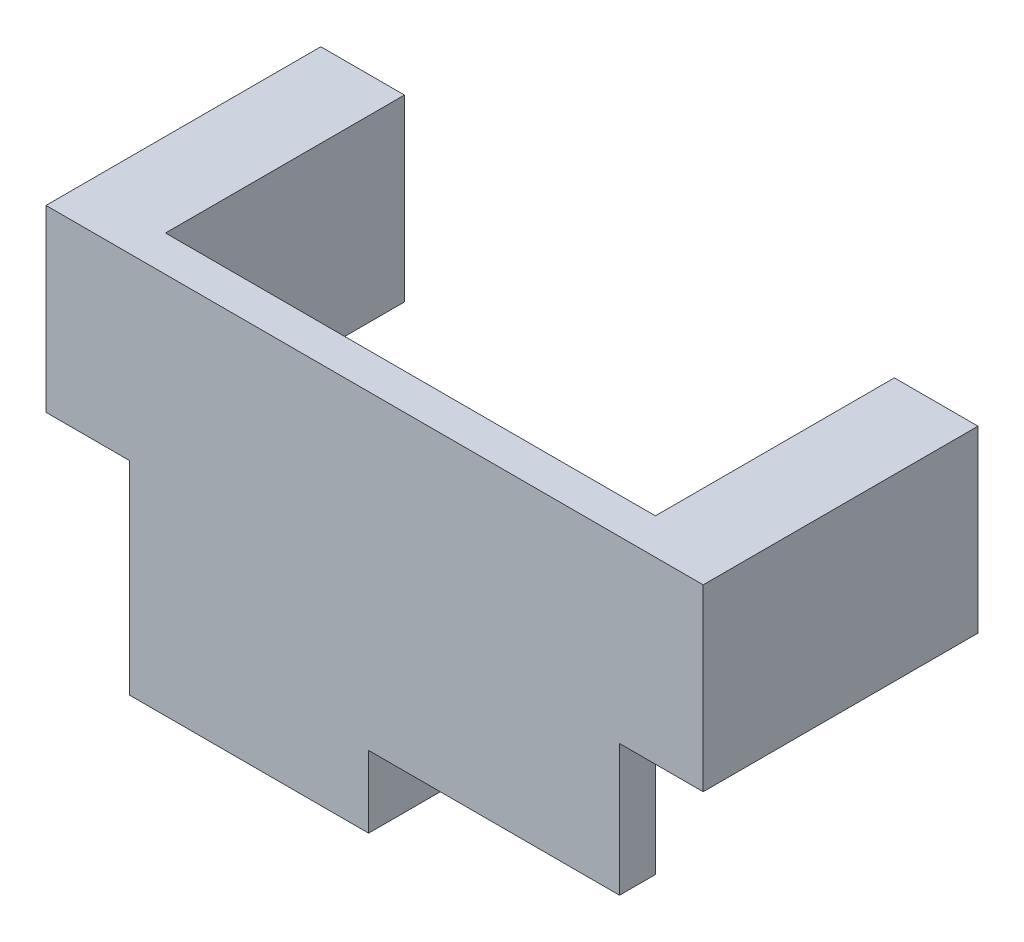
ISO-10303-21;
HEADER;
FILE_DESCRIPTION(('STEP AP214'),'2;1');
FILE_NAME('part.step','',(''),(''),'','','');
FILE_SCHEMA(('AUTOMOTIVE_DESIGN { 1 0 10303 214 1 1 1 1 }'));
ENDSEC;
DATA;
#1=APPLICATION_CONTEXT('core data for automotive mechanical design processes');
#2=APPLICATION_PROTOCOL_DEFINITION('international standard','automotive_design',2000,#1);
#3=PRODUCT_CONTEXT('',#1,'mechanical');
#4=PRODUCT('Part','Part','',(#3));
#5=PRODUCT_RELATED_PRODUCT_CATEGORY('part','',(#4));
#6=PRODUCT_DEFINITION_FORMATION('','',#4);
#7=PRODUCT_DEFINITION_CONTEXT('part definition',#1,'design');
#8=PRODUCT_DEFINITION('design','',#6,#7);
#9=PRODUCT_DEFINITION_SHAPE('','',#8);
#10=(LENGTH_UNIT() NAMED_UNIT(*) SI_UNIT(.MILLI.,.METRE.));
#11=(NAMED_UNIT(*) PLANE_ANGLE_UNIT() SI_UNIT($,.RADIAN.));
#12=(NAMED_UNIT(*) SI_UNIT($,.STERADIAN.) SOLID_ANGLE_UNIT());
#13=UNCERTAINTY_MEASURE_WITH_UNIT(LENGTH_MEASURE(1.E-05),#10,'distance_accuracy_value','');
#14=(GEOMETRIC_REPRESENTATION_CONTEXT(3) GLOBAL_UNCERTAINTY_ASSIGNED_CONTEXT((#13)) GLOBAL_UNIT_ASSIGNED_CONTEXT((#10,
#11,#12)) REPRESENTATION_CONTEXT('',''));
#15=CARTESIAN_POINT('',(0.,0.,0.));
#16=DIRECTION('',(0.,0.,1.));
#17=DIRECTION('',(1.,0.,0.));
#18=AXIS2_PLACEMENT_3D('',#15,#16,#17);
#19=CARTESIAN_POINT('',(-20.5,0.,-3.));
#20=DIRECTION('',(1.,0.,0.));
#21=DIRECTION('',(0.,0.,-1.));
#22=AXIS2_PLACEMENT_3D('',#19,#20,#21);
#23=PLANE('',#22);
#24=DIRECTION('',(0.,0.,1.));
#25=VECTOR('',#24,1.);
#26=CARTESIAN_POINT('',(-20.5,-2.,-63.8806130178211));
#27=LINE('',#26,#25);
#28=CARTESIAN_POINT('',(-20.5,-2.,-3.));
#29=VERTEX_POINT('',#28);
#30=CARTESIAN_POINT('',(-20.5,-2.,0.));
#31=VERTEX_POINT('',#30);
#32=EDGE_CURVE('E12',#29,#31,#27,.T.);
#33=ORIENTED_EDGE('',*,*,#32,.F.);
#34=DIRECTION('',(0.,1.,0.));
#35=VECTOR('',#34,1.);
#36=CARTESIAN_POINT('',(-20.5,0.,-3.));
#37=LINE('',#36,#35);
#38=CARTESIAN_POINT('',(-20.5,-13.,-3.));
#39=VERTEX_POINT('',#38);
#40=EDGE_CURVE('E286',#39,#29,#37,.T.);
#41=ORIENTED_EDGE('',*,*,#40,.F.);
#42=DIRECTION('',(0.,0.,1.));
#43=VECTOR('',#42,1.);
#44=CARTESIAN_POINT('',(-20.5,-13.,-63.8806130178211));
#45=LINE('',#44,#43);
#46=CARTESIAN_POINT('',(-20.5,-13.,-23.));
#47=VERTEX_POINT('',#46);
#48=EDGE_CURVE('E225',#47,#39,#45,.T.);
#49=ORIENTED_EDGE('',*,*,#48,.F.);
#50=DIRECTION('',(0.,1.,0.));
#51=VECTOR('',#50,1.);
#52=CARTESIAN_POINT('',(-20.5,0.,-23.));
#53=LINE('',#52,#51);
#54=CARTESIAN_POINT('',(-20.5,-19.,-23.));
#55=VERTEX_POINT('',#54);
#56=EDGE_CURVE('E199',#55,#47,#53,.T.);
#57=ORIENTED_EDGE('',*,*,#56,.F.);
#58=DIRECTION('',(0.,0.,1.));
#59=VECTOR('',#58,1.);
#60=CARTESIAN_POINT('',(-20.5,-19.,-63.8806130178211));
#61=LINE('',#60,#59);
#62=CARTESIAN_POINT('',(-20.5,-19.,0.));
#63=VERTEX_POINT('',#62);
#64=EDGE_CURVE('E221',#55,#63,#61,.T.);
#65=ORIENTED_EDGE('',*,*,#64,.T.);
#66=DIRECTION('',(0.,1.,0.));
#67=VECTOR('',#66,1.);
#68=CARTESIAN_POINT('',(-20.5,0.,0.));
#69=LINE('',#68,#67);
#70=EDGE_CURVE('E161',#63,#31,#69,.T.);
#71=ORIENTED_EDGE('',*,*,#70,.T.);
#72=EDGE_LOOP('',(#33,#41,#49,#57,#65,#71));
#73=FACE_BOUND('',#72,.T.);
#74=ADVANCED_FACE('F43',(#73),#23,.F.);
#75=CARTESIAN_POINT('',(20.5,0.,-3.));
#76=DIRECTION('',(1.,0.,0.));
#77=DIRECTION('',(0.,0.,-1.));
#78=AXIS2_PLACEMENT_3D('',#75,#76,#77);
#79=PLANE('',#78);
#80=DIRECTION('',(0.,1.,0.));
#81=VECTOR('',#80,1.);
#82=CARTESIAN_POINT('',(20.5,0.,-3.));
#83=LINE('',#82,#81);
#84=CARTESIAN_POINT('',(20.5,-13.,-3.));
#85=VERTEX_POINT('',#84);
#86=CARTESIAN_POINT('',(20.5,-2.,-3.));
#87=VERTEX_POINT('',#86);
#88=EDGE_CURVE('E277',#85,#87,#83,.T.);
#89=ORIENTED_EDGE('',*,*,#88,.T.);
#90=DIRECTION('',(0.,0.,1.));
#91=VECTOR('',#90,1.);
#92=CARTESIAN_POINT('',(20.5,-2.,-63.8806130178211));
#93=LINE('',#92,#91);
#94=CARTESIAN_POINT('',(20.5,-2.,0.));
#95=VERTEX_POINT('',#94);
#96=EDGE_CURVE('E262',#87,#95,#93,.T.);
#97=ORIENTED_EDGE('',*,*,#96,.T.);
#98=DIRECTION('',(0.,1.,0.));
#99=VECTOR('',#98,1.);
#100=CARTESIAN_POINT('',(20.5,0.,0.));
#101=LINE('',#100,#99);
#102=CARTESIAN_POINT('',(20.5,-13.,0.));
#103=VERTEX_POINT('',#102);
#104=EDGE_CURVE('E162',#103,#95,#101,.T.);
#105=ORIENTED_EDGE('',*,*,#104,.F.);
#106=DIRECTION('',(0.,0.,1.));
#107=VECTOR('',#106,1.);
#108=CARTESIAN_POINT('',(20.5,-13.,-3.));
#109=LINE('',#108,#107);
#110=EDGE_CURVE('E47',#85,#103,#109,.T.);
#111=ORIENTED_EDGE('',*,*,#110,.F.);
#112=EDGE_LOOP('',(#89,#97,#105,#111));
#113=FACE_BOUND('',#112,.T.);
#114=ADVANCED_FACE('F302',(#113),#79,.T.);
#115=CARTESIAN_POINT('',(0.,-13.,-3.));
#116=DIRECTION('',(0.,-1.,0.));
#117=DIRECTION('',(0.,0.,-1.));
#118=AXIS2_PLACEMENT_3D('',#115,#116,#117);
#119=PLANE('',#118);
#120=DIRECTION('',(0.,0.,1.));
#121=VECTOR('',#120,1.);
#122=CARTESIAN_POINT('',(-0.5,-13.,-63.8806130178211));
#123=LINE('',#122,#121);
#124=CARTESIAN_POINT('',(-0.5,-13.,-3.));
#125=VERTEX_POINT('',#124);
#126=CARTESIAN_POINT('',(-0.5,-13.,0.));
#127=VERTEX_POINT('',#126);
#128=EDGE_CURVE('E53',#125,#127,#123,.T.);
#129=ORIENTED_EDGE('',*,*,#128,.F.);
#130=DIRECTION('',(1.,0.,0.));
#131=VECTOR('',#130,1.);
#132=CARTESIAN_POINT('',(0.,-13.,-3.));
#133=LINE('',#132,#131);
#134=EDGE_CURVE('E276',#125,#85,#133,.T.);
#135=ORIENTED_EDGE('',*,*,#134,.T.);
#136=ORIENTED_EDGE('',*,*,#110,.T.);
#137=DIRECTION('',(1.,0.,0.));
#138=VECTOR('',#137,1.);
#139=CARTESIAN_POINT('',(0.,-13.,0.));
#140=LINE('',#139,#138);
#141=EDGE_CURVE('E247',#127,#103,#140,.T.);
#142=ORIENTED_EDGE('',*,*,#141,.F.);
#143=EDGE_LOOP('',(#129,#135,#136,#142));
#144=FACE_BOUND('',#143,.T.);
#145=ADVANCED_FACE('F45',(#144),#119,.T.);
#146=CARTESIAN_POINT('',(0.,13.,-3.));
#147=DIRECTION('',(0.,-1.,0.));
#148=DIRECTION('',(0.,0.,-1.));
#149=AXIS2_PLACEMENT_3D('',#146,#147,#148);
#150=PLANE('',#149);
#151=DIRECTION('',(1.,0.,0.));
#152=VECTOR('',#151,1.);
#153=CARTESIAN_POINT('',(0.,13.,0.));
#154=LINE('',#153,#152);
#155=CARTESIAN_POINT('',(-27.5,13.,0.));
#156=VERTEX_POINT('',#155);
#157=CARTESIAN_POINT('',(27.5,13.,0.));
#158=VERTEX_POINT('',#157);
#159=EDGE_CURVE('E148',#156,#158,#154,.T.);
#160=ORIENTED_EDGE('',*,*,#159,.T.);
#161=DIRECTION('',(0.,0.,1.));
#162=VECTOR('',#161,1.);
#163=CARTESIAN_POINT('',(27.5,13.,-63.8806130178211));
#164=LINE('',#163,#162);
#165=CARTESIAN_POINT('',(27.5,13.,-23.));
#166=VERTEX_POINT('',#165);
#167=EDGE_CURVE('E253',#166,#158,#164,.T.);
#168=ORIENTED_EDGE('',*,*,#167,.F.);
#169=DIRECTION('',(-1.,0.,0.));
#170=VECTOR('',#169,1.);
#171=CARTESIAN_POINT('',(0.,13.,-23.));
#172=LINE('',#171,#170);
#173=CARTESIAN_POINT('',(20.5,13.,-23.));
#174=VERTEX_POINT('',#173);
#175=EDGE_CURVE('E240',#166,#174,#172,.T.);
#176=ORIENTED_EDGE('',*,*,#175,.T.);
#177=DIRECTION('',(0.,0.,1.));
#178=VECTOR('',#177,1.);
#179=CARTESIAN_POINT('',(20.5,13.,-63.8806130178211));
#180=LINE('',#179,#178);
#181=CARTESIAN_POINT('',(20.5,13.,-3.));
#182=VERTEX_POINT('',#181);
#183=EDGE_CURVE('E261',#174,#182,#180,.T.);
#184=ORIENTED_EDGE('',*,*,#183,.T.);
#185=DIRECTION('',(1.,0.,0.));
#186=VECTOR('',#185,1.);
#187=CARTESIAN_POINT('',(0.,13.,-3.));
#188=LINE('',#187,#186);
#189=CARTESIAN_POINT('',(-20.5,13.,-3.));
#190=VERTEX_POINT('',#189);
#191=EDGE_CURVE('E281',#190,#182,#188,.T.);
#192=ORIENTED_EDGE('',*,*,#191,.F.);
#193=DIRECTION('',(0.,0.,1.));
#194=VECTOR('',#193,1.);
#195=CARTESIAN_POINT('',(-20.5,13.,-63.8806130178211));
#196=LINE('',#195,#194);
#197=CARTESIAN_POINT('',(-20.5,13.,-23.));
#198=VERTEX_POINT('',#197);
#199=EDGE_CURVE('E174',#198,#190,#196,.T.);
#200=ORIENTED_EDGE('',*,*,#199,.F.);
#201=DIRECTION('',(1.,0.,0.));
#202=VECTOR('',#201,1.);
#203=CARTESIAN_POINT('',(0.,13.,-23.));
#204=LINE('',#203,#202);
#205=CARTESIAN_POINT('',(-27.5,13.,-23.));
#206=VERTEX_POINT('',#205);
#207=EDGE_CURVE('E169',#206,#198,#204,.T.);
#208=ORIENTED_EDGE('',*,*,#207,.F.);
#209=DIRECTION('',(0.,0.,1.));
#210=VECTOR('',#209,1.);
#211=CARTESIAN_POINT('',(-27.5,13.,-63.8806130178211));
#212=LINE('',#211,#210);
#213=EDGE_CURVE('E166',#206,#156,#212,.T.);
#214=ORIENTED_EDGE('',*,*,#213,.T.);
#215=EDGE_LOOP('',(#160,#168,#176,#184,#192,#200,#208,#214));
#216=FACE_BOUND('',#215,.T.);
#217=ADVANCED_FACE('F167',(#216),#150,.F.);
#218=CARTESIAN_POINT('',(0.,0.,-3.));
#219=DIRECTION('',(0.,0.,1.));
#220=DIRECTION('',(1.,0.,0.));
#221=AXIS2_PLACEMENT_3D('',#218,#219,#220);
#222=PLANE('',#221);
#223=EDGE_CURVE('E271',#39,#125,#133,.T.);
#224=ORIENTED_EDGE('',*,*,#223,.F.);
#225=ORIENTED_EDGE('',*,*,#40,.T.);
#226=EDGE_CURVE('E285',#29,#190,#37,.T.);
#227=ORIENTED_EDGE('',*,*,#226,.T.);
#228=ORIENTED_EDGE('',*,*,#191,.T.);
#229=EDGE_CURVE('E275',#87,#182,#83,.T.);
#230=ORIENTED_EDGE('',*,*,#229,.F.);
#231=ORIENTED_EDGE('',*,*,#88,.F.);
#232=ORIENTED_EDGE('',*,*,#134,.F.);
#233=EDGE_LOOP('',(#224,#225,#227,#228,#230,#231,#232));
#234=FACE_BOUND('',#233,.T.);
#235=ADVANCED_FACE('F306',(#234),#222,.F.);
#236=CARTESIAN_POINT('',(0.,0.,0.));
#237=DIRECTION('',(0.,0.,1.));
#238=DIRECTION('',(1.,0.,0.));
#239=AXIS2_PLACEMENT_3D('',#236,#237,#238);
#240=PLANE('',#239);
#241=ORIENTED_EDGE('',*,*,#70,.F.);
#242=DIRECTION('',(1.,0.,0.));
#243=VECTOR('',#242,1.);
#244=CARTESIAN_POINT('',(0.,-19.,0.));
#245=LINE('',#244,#243);
#246=CARTESIAN_POINT('',(-0.5,-19.,0.));
#247=VERTEX_POINT('',#246);
#248=EDGE_CURVE('E213',#63,#247,#245,.T.);
#249=ORIENTED_EDGE('',*,*,#248,.T.);
#250=DIRECTION('',(0.,-1.,0.));
#251=VECTOR('',#250,1.);
#252=CARTESIAN_POINT('',(-0.5,0.,0.));
#253=LINE('',#252,#251);
#254=EDGE_CURVE('E198',#127,#247,#253,.T.);
#255=ORIENTED_EDGE('',*,*,#254,.F.);
#256=ORIENTED_EDGE('',*,*,#141,.T.);
#257=ORIENTED_EDGE('',*,*,#104,.T.);
#258=DIRECTION('',(1.,0.,0.));
#259=VECTOR('',#258,1.);
#260=CARTESIAN_POINT('',(0.,-2.,0.));
#261=LINE('',#260,#259);
#262=CARTESIAN_POINT('',(27.5,-2.,0.));
#263=VERTEX_POINT('',#262);
#264=EDGE_CURVE('E250',#95,#263,#261,.T.);
#265=ORIENTED_EDGE('',*,*,#264,.T.);
#266=DIRECTION('',(0.,-1.,0.));
#267=VECTOR('',#266,1.);
#268=CARTESIAN_POINT('',(27.5,0.,0.));
#269=LINE('',#268,#267);
#270=EDGE_CURVE('E156',#158,#263,#269,.T.);
#271=ORIENTED_EDGE('',*,*,#270,.F.);
#272=ORIENTED_EDGE('',*,*,#159,.F.);
#273=DIRECTION('',(0.,-1.,0.));
#274=VECTOR('',#273,1.);
#275=CARTESIAN_POINT('',(-27.5,0.,0.));
#276=LINE('',#275,#274);
#277=CARTESIAN_POINT('',(-27.5,-2.,0.));
#278=VERTEX_POINT('',#277);
#279=EDGE_CURVE('E153',#156,#278,#276,.T.);
#280=ORIENTED_EDGE('',*,*,#279,.T.);
#281=DIRECTION('',(-1.,0.,0.));
#282=VECTOR('',#281,1.);
#283=CARTESIAN_POINT('',(0.,-2.,0.));
#284=LINE('',#283,#282);
#285=EDGE_CURVE('E180',#31,#278,#284,.T.);
#286=ORIENTED_EDGE('',*,*,#285,.F.);
#287=EDGE_LOOP('',(#241,#249,#255,#256,#257,#265,#271,#272,#280,#286));
#288=FACE_BOUND('',#287,.T.);
#289=ADVANCED_FACE('F150',(#288),#240,.T.);
#290=CARTESIAN_POINT('',(20.5,0.,-63.8806130178211));
#291=DIRECTION('',(1.,0.,0.));
#292=DIRECTION('',(0.,0.,-1.));
#293=AXIS2_PLACEMENT_3D('',#290,#291,#292);
#294=PLANE('',#293);
#295=CARTESIAN_POINT('',(20.5,-2.,-23.));
#296=VERTEX_POINT('',#295);
#297=EDGE_CURVE('E257',#296,#87,#93,.T.);
#298=ORIENTED_EDGE('',*,*,#297,.T.);
#299=ORIENTED_EDGE('',*,*,#229,.T.);
#300=ORIENTED_EDGE('',*,*,#183,.F.);
#301=DIRECTION('',(0.,-1.,0.));
#302=VECTOR('',#301,1.);
#303=CARTESIAN_POINT('',(20.5,0.,-23.));
#304=LINE('',#303,#302);
#305=EDGE_CURVE('E235',#174,#296,#304,.T.);
#306=ORIENTED_EDGE('',*,*,#305,.T.);
#307=EDGE_LOOP('',(#298,#299,#300,#306));
#308=FACE_BOUND('',#307,.T.);
#309=ADVANCED_FACE('F344',(#308),#294,.F.);
#310=CARTESIAN_POINT('',(0.,-2.,-63.8806130178211));
#311=DIRECTION('',(0.,-1.,0.));
#312=DIRECTION('',(0.,0.,-1.));
#313=AXIS2_PLACEMENT_3D('',#310,#311,#312);
#314=PLANE('',#313);
#315=DIRECTION('',(-1.,0.,0.));
#316=VECTOR('',#315,1.);
#317=CARTESIAN_POINT('',(0.,-2.,-23.));
#318=LINE('',#317,#316);
#319=CARTESIAN_POINT('',(27.5,-2.,-23.));
#320=VERTEX_POINT('',#319);
#321=EDGE_CURVE('E239',#320,#296,#318,.T.);
#322=ORIENTED_EDGE('',*,*,#321,.F.);
#323=DIRECTION('',(0.,0.,1.));
#324=VECTOR('',#323,1.);
#325=CARTESIAN_POINT('',(27.5,-2.,-63.8806130178211));
#326=LINE('',#325,#324);
#327=EDGE_CURVE('E254',#320,#263,#326,.T.);
#328=ORIENTED_EDGE('',*,*,#327,.T.);
#329=ORIENTED_EDGE('',*,*,#264,.F.);
#330=ORIENTED_EDGE('',*,*,#96,.F.);
#331=ORIENTED_EDGE('',*,*,#297,.F.);
#332=EDGE_LOOP('',(#322,#328,#329,#330,#331));
#333=FACE_BOUND('',#332,.T.);
#334=ADVANCED_FACE('F351',(#333),#314,.T.);
#335=CARTESIAN_POINT('',(27.5,0.,-63.8806130178211));
#336=DIRECTION('',(-1.,0.,0.));
#337=DIRECTION('',(0.,-1.,0.));
#338=AXIS2_PLACEMENT_3D('',#335,#336,#337);
#339=PLANE('',#338);
#340=ORIENTED_EDGE('',*,*,#327,.F.);
#341=DIRECTION('',(0.,1.,0.));
#342=VECTOR('',#341,1.);
#343=CARTESIAN_POINT('',(27.5,0.,-23.));
#344=LINE('',#343,#342);
#345=EDGE_CURVE('E243',#320,#166,#344,.T.);
#346=ORIENTED_EDGE('',*,*,#345,.T.);
#347=ORIENTED_EDGE('',*,*,#167,.T.);
#348=ORIENTED_EDGE('',*,*,#270,.T.);
#349=EDGE_LOOP('',(#340,#346,#347,#348));
#350=FACE_BOUND('',#349,.T.);
#351=ADVANCED_FACE('F353',(#350),#339,.F.);
#352=CARTESIAN_POINT('',(0.,0.,-23.));
#353=DIRECTION('',(0.,0.,1.));
#354=DIRECTION('',(1.,0.,0.));
#355=AXIS2_PLACEMENT_3D('',#352,#353,#354);
#356=PLANE('',#355);
#357=ORIENTED_EDGE('',*,*,#321,.T.);
#358=ORIENTED_EDGE('',*,*,#305,.F.);
#359=ORIENTED_EDGE('',*,*,#175,.F.);
#360=ORIENTED_EDGE('',*,*,#345,.F.);
#361=EDGE_LOOP('',(#357,#358,#359,#360));
#362=FACE_BOUND('',#361,.T.);
#363=ADVANCED_FACE('F347',(#362),#356,.F.);
#364=CARTESIAN_POINT('',(0.,-13.,-63.8806130178211));
#365=DIRECTION('',(0.,-1.,0.));
#366=DIRECTION('',(0.,0.,-1.));
#367=AXIS2_PLACEMENT_3D('',#364,#365,#366);
#368=PLANE('',#367);
#369=ORIENTED_EDGE('',*,*,#48,.T.);
#370=ORIENTED_EDGE('',*,*,#223,.T.);
#371=CARTESIAN_POINT('',(-0.5,-13.,-23.));
#372=VERTEX_POINT('',#371);
#373=EDGE_CURVE('E217',#372,#125,#123,.T.);
#374=ORIENTED_EDGE('',*,*,#373,.F.);
#375=DIRECTION('',(-1.,0.,0.));
#376=VECTOR('',#375,1.);
#377=CARTESIAN_POINT('',(0.,-13.,-23.));
#378=LINE('',#377,#376);
#379=EDGE_CURVE('E203',#372,#47,#378,.T.);
#380=ORIENTED_EDGE('',*,*,#379,.T.);
#381=EDGE_LOOP('',(#369,#370,#374,#380));
#382=FACE_BOUND('',#381,.T.);
#383=ADVANCED_FACE('F327',(#382),#368,.F.);
#384=CARTESIAN_POINT('',(0.,-19.,-63.8806130178211));
#385=DIRECTION('',(0.,-1.,0.));
#386=DIRECTION('',(0.,0.,-1.));
#387=AXIS2_PLACEMENT_3D('',#384,#385,#386);
#388=PLANE('',#387);
#389=DIRECTION('',(-1.,0.,0.));
#390=VECTOR('',#389,1.);
#391=CARTESIAN_POINT('',(0.,-19.,-23.));
#392=LINE('',#391,#390);
#393=CARTESIAN_POINT('',(-0.5,-19.,-23.));
#394=VERTEX_POINT('',#393);
#395=EDGE_CURVE('E202',#394,#55,#392,.T.);
#396=ORIENTED_EDGE('',*,*,#395,.F.);
#397=DIRECTION('',(0.,0.,1.));
#398=VECTOR('',#397,1.);
#399=CARTESIAN_POINT('',(-0.5,-19.,-63.8806130178211));
#400=LINE('',#399,#398);
#401=EDGE_CURVE('E218',#394,#247,#400,.T.);
#402=ORIENTED_EDGE('',*,*,#401,.T.);
#403=ORIENTED_EDGE('',*,*,#248,.F.);
#404=ORIENTED_EDGE('',*,*,#64,.F.);
#405=EDGE_LOOP('',(#396,#402,#403,#404));
#406=FACE_BOUND('',#405,.T.);
#407=ADVANCED_FACE('F323',(#406),#388,.T.);
#408=CARTESIAN_POINT('',(-0.5,0.,-63.8806130178211));
#409=DIRECTION('',(-1.,0.,0.));
#410=DIRECTION('',(0.,0.,1.));
#411=AXIS2_PLACEMENT_3D('',#408,#409,#410);
#412=PLANE('',#411);
#413=ORIENTED_EDGE('',*,*,#401,.F.);
#414=DIRECTION('',(0.,1.,0.));
#415=VECTOR('',#414,1.);
#416=CARTESIAN_POINT('',(-0.5,0.,-23.));
#417=LINE('',#416,#415);
#418=EDGE_CURVE('E206',#394,#372,#417,.T.);
#419=ORIENTED_EDGE('',*,*,#418,.T.);
#420=ORIENTED_EDGE('',*,*,#373,.T.);
#421=ORIENTED_EDGE('',*,*,#128,.T.);
#422=ORIENTED_EDGE('',*,*,#254,.T.);
#423=EDGE_LOOP('',(#413,#419,#420,#421,#422));
#424=FACE_BOUND('',#423,.T.);
#425=ADVANCED_FACE('F317',(#424),#412,.F.);
#426=CARTESIAN_POINT('',(0.,0.,-23.));
#427=DIRECTION('',(0.,0.,1.));
#428=DIRECTION('',(1.,0.,0.));
#429=AXIS2_PLACEMENT_3D('',#426,#427,#428);
#430=PLANE('',#429);
#431=ORIENTED_EDGE('',*,*,#395,.T.);
#432=ORIENTED_EDGE('',*,*,#56,.T.);
#433=ORIENTED_EDGE('',*,*,#379,.F.);
#434=ORIENTED_EDGE('',*,*,#418,.F.);
#435=EDGE_LOOP('',(#431,#432,#433,#434));
#436=FACE_BOUND('',#435,.T.);
#437=ADVANCED_FACE('F472',(#436),#430,.F.);
#438=CARTESIAN_POINT('',(-20.5,0.,-63.8806130178211));
#439=DIRECTION('',(1.,0.,0.));
#440=DIRECTION('',(0.,0.,-1.));
#441=AXIS2_PLACEMENT_3D('',#438,#439,#440);
#442=PLANE('',#441);
#443=ORIENTED_EDGE('',*,*,#226,.F.);
#444=CARTESIAN_POINT('',(-20.5,-2.,-23.));
#445=VERTEX_POINT('',#444);
#446=EDGE_CURVE('E55',#445,#29,#27,.T.);
#447=ORIENTED_EDGE('',*,*,#446,.F.);
#448=DIRECTION('',(0.,-1.,0.));
#449=VECTOR('',#448,1.);
#450=CARTESIAN_POINT('',(-20.5,0.,-23.));
#451=LINE('',#450,#449);
#452=EDGE_CURVE('E185',#198,#445,#451,.T.);
#453=ORIENTED_EDGE('',*,*,#452,.F.);
#454=ORIENTED_EDGE('',*,*,#199,.T.);
#455=EDGE_LOOP('',(#443,#447,#453,#454));
#456=FACE_BOUND('',#455,.T.);
#457=ADVANCED_FACE('F332',(#456),#442,.T.);
#458=CARTESIAN_POINT('',(0.,-2.,-63.8806130178211));
#459=DIRECTION('',(0.,1.,0.));
#460=DIRECTION('',(0.,0.,1.));
#461=AXIS2_PLACEMENT_3D('',#458,#459,#460);
#462=PLANE('',#461);
#463=DIRECTION('',(0.,0.,1.));
#464=VECTOR('',#463,1.);
#465=CARTESIAN_POINT('',(-27.5,-2.,-63.8806130178211));
#466=LINE('',#465,#464);
#467=CARTESIAN_POINT('',(-27.5,-2.,-23.));
#468=VERTEX_POINT('',#467);
#469=EDGE_CURVE('E173',#468,#278,#466,.T.);
#470=ORIENTED_EDGE('',*,*,#469,.F.);
#471=DIRECTION('',(1.,0.,0.));
#472=VECTOR('',#471,1.);
#473=CARTESIAN_POINT('',(0.,-2.,-23.));
#474=LINE('',#473,#472);
#475=EDGE_CURVE('E337',#468,#445,#474,.T.);
#476=ORIENTED_EDGE('',*,*,#475,.T.);
#477=ORIENTED_EDGE('',*,*,#446,.T.);
#478=ORIENTED_EDGE('',*,*,#32,.T.);
#479=ORIENTED_EDGE('',*,*,#285,.T.);
#480=EDGE_LOOP('',(#470,#476,#477,#478,#479));
#481=FACE_BOUND('',#480,.T.);
#482=ADVANCED_FACE('F336',(#481),#462,.F.);
#483=CARTESIAN_POINT('',(-27.5,0.,-63.8806130178211));
#484=DIRECTION('',(-1.,0.,0.));
#485=DIRECTION('',(0.,-1.,0.));
#486=AXIS2_PLACEMENT_3D('',#483,#484,#485);
#487=PLANE('',#486);
#488=DIRECTION('',(0.,1.,0.));
#489=VECTOR('',#488,1.);
#490=CARTESIAN_POINT('',(-27.5,0.,-23.));
#491=LINE('',#490,#489);
#492=EDGE_CURVE('E190',#468,#206,#491,.T.);
#493=ORIENTED_EDGE('',*,*,#492,.F.);
#494=ORIENTED_EDGE('',*,*,#469,.T.);
#495=ORIENTED_EDGE('',*,*,#279,.F.);
#496=ORIENTED_EDGE('',*,*,#213,.F.);
#497=EDGE_LOOP('',(#493,#494,#495,#496));
#498=FACE_BOUND('',#497,.T.);
#499=ADVANCED_FACE('F176',(#498),#487,.T.);
#500=CARTESIAN_POINT('',(0.,0.,-23.));
#501=DIRECTION('',(0.,0.,1.));
#502=DIRECTION('',(1.,0.,0.));
#503=AXIS2_PLACEMENT_3D('',#500,#501,#502);
#504=PLANE('',#503);
#505=ORIENTED_EDGE('',*,*,#452,.T.);
#506=ORIENTED_EDGE('',*,*,#475,.F.);
#507=ORIENTED_EDGE('',*,*,#492,.T.);
#508=ORIENTED_EDGE('',*,*,#207,.T.);
#509=EDGE_LOOP('',(#505,#506,#507,#508));
#510=FACE_BOUND('',#509,.T.);
#511=ADVANCED_FACE('F343',(#510),#504,.F.);
#512=CLOSED_SHELL('',(#74,#114,#145,#217,#235,#289,#309,#334,#351,#363,#383,#407,#425,#437,#457,
#482,#499,#511));
#513=MANIFOLD_SOLID_BREP('B2',#512);
#514=ADVANCED_BREP_SHAPE_REPRESENTATION('',(#18,#513),#14);
#515=SHAPE_DEFINITION_REPRESENTATION(#9,#514);
ENDSEC;
END-ISO-10303-21;
